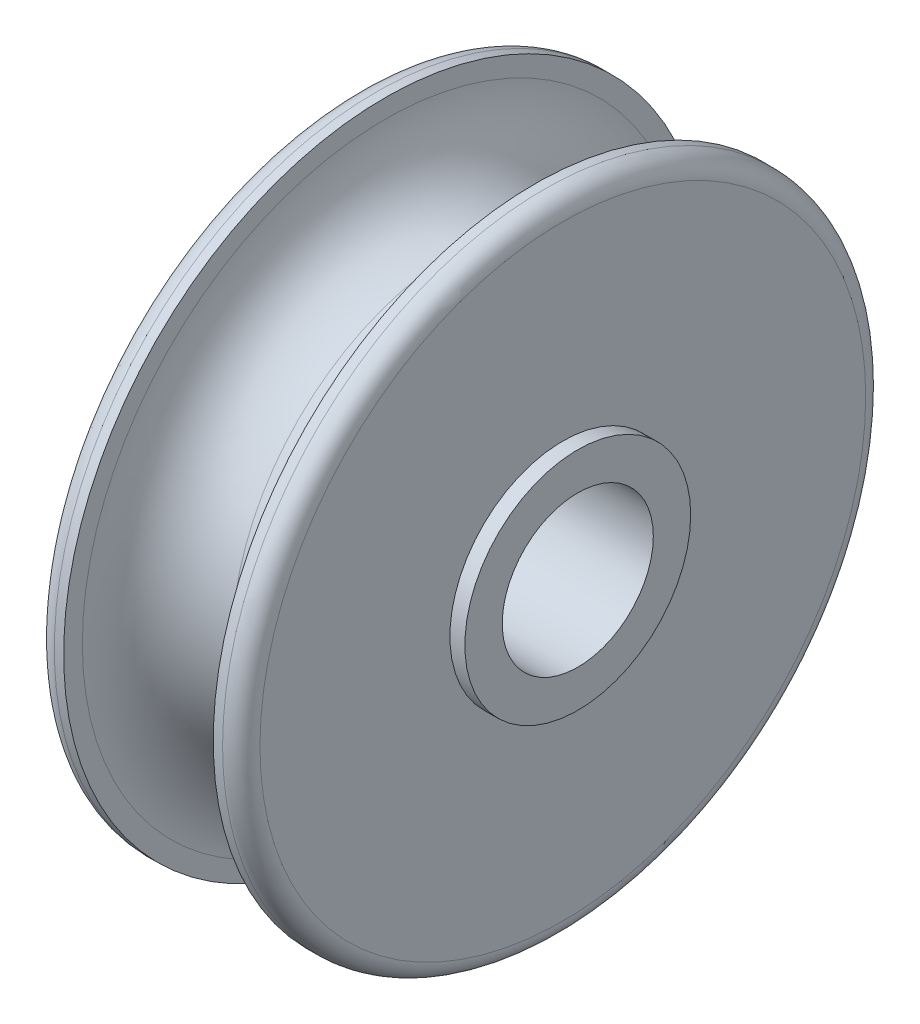
ISO-10303-21;
HEADER;
FILE_DESCRIPTION(('STEP AP214'),'2;1');
FILE_NAME('part.step','',(''),(''),'','','');
FILE_SCHEMA(('AUTOMOTIVE_DESIGN { 1 0 10303 214 1 1 1 1 }'));
ENDSEC;
DATA;
#1=APPLICATION_CONTEXT('core data for automotive mechanical design processes');
#2=APPLICATION_PROTOCOL_DEFINITION('international standard','automotive_design',2000,#1);
#3=PRODUCT_CONTEXT('',#1,'mechanical');
#4=PRODUCT('Part','Part','',(#3));
#5=PRODUCT_RELATED_PRODUCT_CATEGORY('part','',(#4));
#6=PRODUCT_DEFINITION_FORMATION('','',#4);
#7=PRODUCT_DEFINITION_CONTEXT('part definition',#1,'design');
#8=PRODUCT_DEFINITION('design','',#6,#7);
#9=PRODUCT_DEFINITION_SHAPE('','',#8);
#10=(LENGTH_UNIT() NAMED_UNIT(*) SI_UNIT(.MILLI.,.METRE.));
#11=(NAMED_UNIT(*) PLANE_ANGLE_UNIT() SI_UNIT($,.RADIAN.));
#12=(NAMED_UNIT(*) SI_UNIT($,.STERADIAN.) SOLID_ANGLE_UNIT());
#13=UNCERTAINTY_MEASURE_WITH_UNIT(LENGTH_MEASURE(1.E-05),#10,'distance_accuracy_value','');
#14=(GEOMETRIC_REPRESENTATION_CONTEXT(3) GLOBAL_UNCERTAINTY_ASSIGNED_CONTEXT((#13)) GLOBAL_UNIT_ASSIGNED_CONTEXT((#10,
#11,#12)) REPRESENTATION_CONTEXT('',''));
#15=CARTESIAN_POINT('',(0.,0.,0.));
#16=DIRECTION('',(0.,0.,1.));
#17=DIRECTION('',(1.,0.,0.));
#18=AXIS2_PLACEMENT_3D('',#15,#16,#17);
#19=CARTESIAN_POINT('',(-0.2,-1.01,0.));
#20=DIRECTION('',(-1.,0.,0.));
#21=DIRECTION('',(0.,0.,-1.));
#22=AXIS2_PLACEMENT_3D('',#19,#20,#21);
#23=PLANE('',#22);
#24=CARTESIAN_POINT('',(-0.2,0.,0.));
#25=DIRECTION('',(1.,0.,0.));
#26=DIRECTION('',(0.,0.,-1.));
#27=AXIS2_PLACEMENT_3D('',#24,#25,#26);
#28=CIRCLE('',#27,1.51);
#29=CARTESIAN_POINT('',(-0.2,0.,-1.51));
#30=VERTEX_POINT('',#29);
#31=EDGE_CURVE('E65',#30,#30,#28,.T.);
#32=ORIENTED_EDGE('',*,*,#31,.F.);
#33=EDGE_LOOP('',(#32));
#34=FACE_BOUND('',#33,.T.);
#35=CARTESIAN_POINT('',(-0.200000000000001,0.,0.));
#36=DIRECTION('',(1.,0.,0.));
#37=DIRECTION('',(0.,0.,-1.));
#38=AXIS2_PLACEMENT_3D('',#35,#36,#37);
#39=CIRCLE('',#38,1.01);
#40=CARTESIAN_POINT('',(-0.200000000000001,0.,-1.01));
#41=VERTEX_POINT('',#40);
#42=EDGE_CURVE('E62',#41,#41,#39,.T.);
#43=ORIENTED_EDGE('',*,*,#42,.T.);
#44=EDGE_LOOP('',(#43));
#45=FACE_BOUND('',#44,.T.);
#46=ADVANCED_FACE('F36',(#34,#45),#23,.T.);
#47=CARTESIAN_POINT('',(0.,0.,0.));
#48=DIRECTION('',(-1.,0.,0.));
#49=DIRECTION('',(0.,0.,-1.));
#50=AXIS2_PLACEMENT_3D('',#47,#48,#49);
#51=CYLINDRICAL_SURFACE('',#50,1.51);
#52=CARTESIAN_POINT('',(0.,0.,0.));
#53=DIRECTION('',(1.,0.,0.));
#54=DIRECTION('',(0.,0.,-1.));
#55=AXIS2_PLACEMENT_3D('',#52,#53,#54);
#56=CIRCLE('',#55,1.51);
#57=CARTESIAN_POINT('',(0.,0.,-1.51));
#58=VERTEX_POINT('',#57);
#59=EDGE_CURVE('E68',#58,#58,#56,.T.);
#60=ORIENTED_EDGE('',*,*,#59,.F.);
#61=EDGE_LOOP('',(#60));
#62=FACE_BOUND('',#61,.T.);
#63=ORIENTED_EDGE('',*,*,#31,.T.);
#64=EDGE_LOOP('',(#63));
#65=FACE_BOUND('',#64,.T.);
#66=ADVANCED_FACE('F111',(#62,#65),#51,.T.);
#67=CARTESIAN_POINT('',(0.,-4.,0.));
#68=DIRECTION('',(-1.,0.,0.));
#69=DIRECTION('',(0.,0.,-1.));
#70=AXIS2_PLACEMENT_3D('',#67,#68,#69);
#71=PLANE('',#70);
#72=CARTESIAN_POINT('',(0.,0.,0.));
#73=DIRECTION('',(1.,0.,0.));
#74=DIRECTION('',(0.,0.,-1.));
#75=AXIS2_PLACEMENT_3D('',#72,#73,#74);
#76=CIRCLE('',#75,4.05);
#77=CARTESIAN_POINT('',(0.,0.,-4.05));
#78=VERTEX_POINT('',#77);
#79=EDGE_CURVE('E59',#78,#78,#76,.T.);
#80=ORIENTED_EDGE('',*,*,#79,.F.);
#81=EDGE_LOOP('',(#80));
#82=FACE_BOUND('',#81,.T.);
#83=ORIENTED_EDGE('',*,*,#59,.T.);
#84=EDGE_LOOP('',(#83));
#85=FACE_BOUND('',#84,.T.);
#86=ADVANCED_FACE('F105',(#82,#85),#71,.T.);
#87=CARTESIAN_POINT('',(0.,0.,0.));
#88=DIRECTION('',(-1.,0.,0.));
#89=DIRECTION('',(0.,0.,-1.));
#90=AXIS2_PLACEMENT_3D('',#87,#88,#89);
#91=CYLINDRICAL_SURFACE('',#90,4.3);
#92=CARTESIAN_POINT('',(0.25,0.,0.));
#93=DIRECTION('',(1.,0.,0.));
#94=DIRECTION('',(0.,0.,-1.));
#95=AXIS2_PLACEMENT_3D('',#92,#93,#94);
#96=CIRCLE('',#95,4.3);
#97=CARTESIAN_POINT('',(0.25,0.,-4.3));
#98=VERTEX_POINT('',#97);
#99=EDGE_CURVE('E56',#98,#98,#96,.F.);
#100=ORIENTED_EDGE('',*,*,#99,.F.);
#101=EDGE_LOOP('',(#100));
#102=FACE_BOUND('',#101,.T.);
#103=CARTESIAN_POINT('',(0.375,0.,0.));
#104=DIRECTION('',(1.,0.,0.));
#105=DIRECTION('',(0.,0.,-1.));
#106=AXIS2_PLACEMENT_3D('',#103,#104,#105);
#107=CIRCLE('',#106,4.3);
#108=CARTESIAN_POINT('',(0.375,0.,-4.3));
#109=VERTEX_POINT('',#108);
#110=EDGE_CURVE('E71',#109,#109,#107,.T.);
#111=ORIENTED_EDGE('',*,*,#110,.F.);
#112=EDGE_LOOP('',(#111));
#113=FACE_BOUND('',#112,.T.);
#114=ADVANCED_FACE('F100',(#102,#113),#91,.T.);
#115=CARTESIAN_POINT('',(0.375,-4.,0.));
#116=DIRECTION('',(1.,0.,0.));
#117=DIRECTION('',(0.,0.,1.));
#118=AXIS2_PLACEMENT_3D('',#115,#116,#117);
#119=PLANE('',#118);
#120=CARTESIAN_POINT('',(0.375,0.,0.));
#121=DIRECTION('',(-1.,0.,0.));
#122=DIRECTION('',(0.,0.,1.));
#123=AXIS2_PLACEMENT_3D('',#120,#121,#122);
#124=CIRCLE('',#123,4.05);
#125=CARTESIAN_POINT('',(0.375,0.,4.05));
#126=VERTEX_POINT('',#125);
#127=EDGE_CURVE('E44',#126,#126,#124,.F.);
#128=ORIENTED_EDGE('',*,*,#127,.F.);
#129=EDGE_LOOP('',(#128));
#130=FACE_BOUND('',#129,.T.);
#131=ORIENTED_EDGE('',*,*,#110,.T.);
#132=EDGE_LOOP('',(#131));
#133=FACE_BOUND('',#132,.T.);
#134=ADVANCED_FACE('F96',(#130,#133),#119,.T.);
#135=CARTESIAN_POINT('',(2.375,-4.,0.));
#136=DIRECTION('',(-1.,0.,0.));
#137=DIRECTION('',(0.,0.,-1.));
#138=AXIS2_PLACEMENT_3D('',#135,#136,#137);
#139=PLANE('',#138);
#140=CARTESIAN_POINT('',(2.375,0.,0.));
#141=DIRECTION('',(1.,0.,0.));
#142=DIRECTION('',(0.,0.,-1.));
#143=AXIS2_PLACEMENT_3D('',#140,#141,#142);
#144=CIRCLE('',#143,4.05);
#145=CARTESIAN_POINT('',(2.375,0.,-4.05));
#146=VERTEX_POINT('',#145);
#147=EDGE_CURVE('E10',#146,#146,#144,.F.);
#148=ORIENTED_EDGE('',*,*,#147,.F.);
#149=EDGE_LOOP('',(#148));
#150=FACE_BOUND('',#149,.T.);
#151=CARTESIAN_POINT('',(2.375,0.,0.));
#152=DIRECTION('',(1.,0.,0.));
#153=DIRECTION('',(0.,0.,-1.));
#154=AXIS2_PLACEMENT_3D('',#151,#152,#153);
#155=CIRCLE('',#154,4.3);
#156=CARTESIAN_POINT('',(2.375,0.,-4.3));
#157=VERTEX_POINT('',#156);
#158=EDGE_CURVE('E74',#157,#157,#155,.T.);
#159=ORIENTED_EDGE('',*,*,#158,.F.);
#160=EDGE_LOOP('',(#159));
#161=FACE_BOUND('',#160,.T.);
#162=ADVANCED_FACE('F99',(#150,#161),#139,.T.);
#163=CARTESIAN_POINT('',(0.,0.,0.));
#164=DIRECTION('',(-1.,0.,0.));
#165=DIRECTION('',(0.,0.,-1.));
#166=AXIS2_PLACEMENT_3D('',#163,#164,#165);
#167=CYLINDRICAL_SURFACE('',#166,4.3);
#168=CARTESIAN_POINT('',(2.5,0.,0.));
#169=DIRECTION('',(-1.,0.,0.));
#170=DIRECTION('',(0.,0.,1.));
#171=AXIS2_PLACEMENT_3D('',#168,#169,#170);
#172=CIRCLE('',#171,4.3);
#173=CARTESIAN_POINT('',(2.5,0.,4.3));
#174=VERTEX_POINT('',#173);
#175=EDGE_CURVE('E53',#174,#174,#172,.F.);
#176=ORIENTED_EDGE('',*,*,#175,.F.);
#177=EDGE_LOOP('',(#176));
#178=FACE_BOUND('',#177,.T.);
#179=ORIENTED_EDGE('',*,*,#158,.T.);
#180=EDGE_LOOP('',(#179));
#181=FACE_BOUND('',#180,.T.);
#182=ADVANCED_FACE('F141',(#178,#181),#167,.T.);
#183=CARTESIAN_POINT('',(2.75,-1.51,0.));
#184=DIRECTION('',(1.,0.,0.));
#185=DIRECTION('',(0.,0.,1.));
#186=AXIS2_PLACEMENT_3D('',#183,#184,#185);
#187=PLANE('',#186);
#188=CARTESIAN_POINT('',(2.75,0.,0.));
#189=DIRECTION('',(-1.,0.,0.));
#190=DIRECTION('',(0.,0.,1.));
#191=AXIS2_PLACEMENT_3D('',#188,#189,#190);
#192=CIRCLE('',#191,4.05);
#193=CARTESIAN_POINT('',(2.75,0.,4.05));
#194=VERTEX_POINT('',#193);
#195=EDGE_CURVE('E48',#194,#194,#192,.T.);
#196=ORIENTED_EDGE('',*,*,#195,.F.);
#197=EDGE_LOOP('',(#196));
#198=FACE_BOUND('',#197,.T.);
#199=CARTESIAN_POINT('',(2.75,0.,0.));
#200=DIRECTION('',(1.,0.,0.));
#201=DIRECTION('',(0.,0.,-1.));
#202=AXIS2_PLACEMENT_3D('',#199,#200,#201);
#203=CIRCLE('',#202,1.51);
#204=CARTESIAN_POINT('',(2.75,0.,-1.51));
#205=VERTEX_POINT('',#204);
#206=EDGE_CURVE('E77',#205,#205,#203,.T.);
#207=ORIENTED_EDGE('',*,*,#206,.F.);
#208=EDGE_LOOP('',(#207));
#209=FACE_BOUND('',#208,.T.);
#210=ADVANCED_FACE('F144',(#198,#209),#187,.T.);
#211=CARTESIAN_POINT('',(0.,0.,0.));
#212=DIRECTION('',(-1.,0.,0.));
#213=DIRECTION('',(0.,0.,-1.));
#214=AXIS2_PLACEMENT_3D('',#211,#212,#213);
#215=CYLINDRICAL_SURFACE('',#214,1.51);
#216=CARTESIAN_POINT('',(2.95,0.,0.));
#217=DIRECTION('',(1.,0.,0.));
#218=DIRECTION('',(0.,0.,-1.));
#219=AXIS2_PLACEMENT_3D('',#216,#217,#218);
#220=CIRCLE('',#219,1.51);
#221=CARTESIAN_POINT('',(2.95,0.,-1.51));
#222=VERTEX_POINT('',#221);
#223=EDGE_CURVE('E80',#222,#222,#220,.T.);
#224=ORIENTED_EDGE('',*,*,#223,.F.);
#225=EDGE_LOOP('',(#224));
#226=FACE_BOUND('',#225,.T.);
#227=ORIENTED_EDGE('',*,*,#206,.T.);
#228=EDGE_LOOP('',(#227));
#229=FACE_BOUND('',#228,.T.);
#230=ADVANCED_FACE('F156',(#226,#229),#215,.T.);
#231=CARTESIAN_POINT('',(2.95,-1.01,0.));
#232=DIRECTION('',(1.,0.,0.));
#233=DIRECTION('',(0.,0.,1.));
#234=AXIS2_PLACEMENT_3D('',#231,#232,#233);
#235=PLANE('',#234);
#236=CARTESIAN_POINT('',(2.95,0.,0.));
#237=DIRECTION('',(1.,0.,0.));
#238=DIRECTION('',(0.,0.,-1.));
#239=AXIS2_PLACEMENT_3D('',#236,#237,#238);
#240=CIRCLE('',#239,1.01);
#241=CARTESIAN_POINT('',(2.95,0.,-1.01));
#242=VERTEX_POINT('',#241);
#243=EDGE_CURVE('E83',#242,#242,#240,.T.);
#244=ORIENTED_EDGE('',*,*,#243,.F.);
#245=EDGE_LOOP('',(#244));
#246=FACE_BOUND('',#245,.T.);
#247=ORIENTED_EDGE('',*,*,#223,.T.);
#248=EDGE_LOOP('',(#247));
#249=FACE_BOUND('',#248,.T.);
#250=ADVANCED_FACE('F160',(#246,#249),#235,.T.);
#251=CARTESIAN_POINT('',(0.,0.,0.));
#252=DIRECTION('',(-1.,0.,0.));
#253=DIRECTION('',(0.,0.,-1.));
#254=AXIS2_PLACEMENT_3D('',#251,#252,#253);
#255=CYLINDRICAL_SURFACE('',#254,1.01);
#256=ORIENTED_EDGE('',*,*,#42,.F.);
#257=EDGE_LOOP('',(#256));
#258=FACE_BOUND('',#257,.T.);
#259=ORIENTED_EDGE('',*,*,#243,.T.);
#260=EDGE_LOOP('',(#259));
#261=FACE_BOUND('',#260,.T.);
#262=ADVANCED_FACE('F130',(#258,#261),#255,.F.);
#263=CARTESIAN_POINT('',(0.25,0.,0.));
#264=DIRECTION('',(-1.,0.,0.));
#265=DIRECTION('',(0.,0.,-1.));
#266=AXIS2_PLACEMENT_3D('',#263,#264,#265);
#267=TOROIDAL_SURFACE('',#266,4.05,0.25);
#268=ORIENTED_EDGE('',*,*,#99,.T.);
#269=EDGE_LOOP('',(#268));
#270=FACE_BOUND('',#269,.T.);
#271=ORIENTED_EDGE('',*,*,#79,.T.);
#272=EDGE_LOOP('',(#271));
#273=FACE_BOUND('',#272,.T.);
#274=ADVANCED_FACE('F126',(#270,#273),#267,.T.);
#275=CARTESIAN_POINT('',(2.5,0.,0.));
#276=DIRECTION('',(1.,0.,0.));
#277=DIRECTION('',(0.,0.,1.));
#278=AXIS2_PLACEMENT_3D('',#275,#276,#277);
#279=TOROIDAL_SURFACE('',#278,4.05,0.25);
#280=ORIENTED_EDGE('',*,*,#195,.T.);
#281=EDGE_LOOP('',(#280));
#282=FACE_BOUND('',#281,.T.);
#283=ORIENTED_EDGE('',*,*,#175,.T.);
#284=EDGE_LOOP('',(#283));
#285=FACE_BOUND('',#284,.T.);
#286=ADVANCED_FACE('F129',(#282,#285),#279,.T.);
#287=CARTESIAN_POINT('',(1.375,0.,0.));
#288=DIRECTION('',(-1.,0.,0.));
#289=DIRECTION('',(0.,0.,-1.));
#290=AXIS2_PLACEMENT_3D('',#287,#288,#289);
#291=TOROIDAL_SURFACE('',#290,4.05,1.);
#292=ORIENTED_EDGE('',*,*,#147,.T.);
#293=EDGE_LOOP('',(#292));
#294=FACE_BOUND('',#293,.T.);
#295=CARTESIAN_POINT('',(1.375,0.,0.));
#296=DIRECTION('',(1.,0.,0.));
#297=DIRECTION('',(0.,0.,-1.));
#298=AXIS2_PLACEMENT_3D('',#295,#296,#297);
#299=CIRCLE('',#298,3.05);
#300=CARTESIAN_POINT('',(1.375,0.,-3.05));
#301=VERTEX_POINT('',#300);
#302=EDGE_CURVE('E40',#301,#301,#299,.T.);
#303=ORIENTED_EDGE('',*,*,#302,.T.);
#304=EDGE_LOOP('',(#303));
#305=FACE_BOUND('',#304,.T.);
#306=ADVANCED_FACE('F38',(#294,#305),#291,.F.);
#307=CARTESIAN_POINT('',(1.375,0.,0.));
#308=DIRECTION('',(1.,0.,0.));
#309=DIRECTION('',(0.,0.,1.));
#310=AXIS2_PLACEMENT_3D('',#307,#308,#309);
#311=TOROIDAL_SURFACE('',#310,4.05,1.);
#312=ORIENTED_EDGE('',*,*,#302,.F.);
#313=EDGE_LOOP('',(#312));
#314=FACE_BOUND('',#313,.T.);
#315=ORIENTED_EDGE('',*,*,#127,.T.);
#316=EDGE_LOOP('',(#315));
#317=FACE_BOUND('',#316,.T.);
#318=ADVANCED_FACE('F91',(#314,#317),#311,.F.);
#319=CLOSED_SHELL('',(#46,#66,#86,#114,#134,#162,#182,#210,#230,#250,#262,#274,#286,#306,#318));
#320=MANIFOLD_SOLID_BREP('B2',#319);
#321=ADVANCED_BREP_SHAPE_REPRESENTATION('',(#18,#320),#14);
#322=SHAPE_DEFINITION_REPRESENTATION(#9,#321);
ENDSEC;
END-ISO-10303-21;
